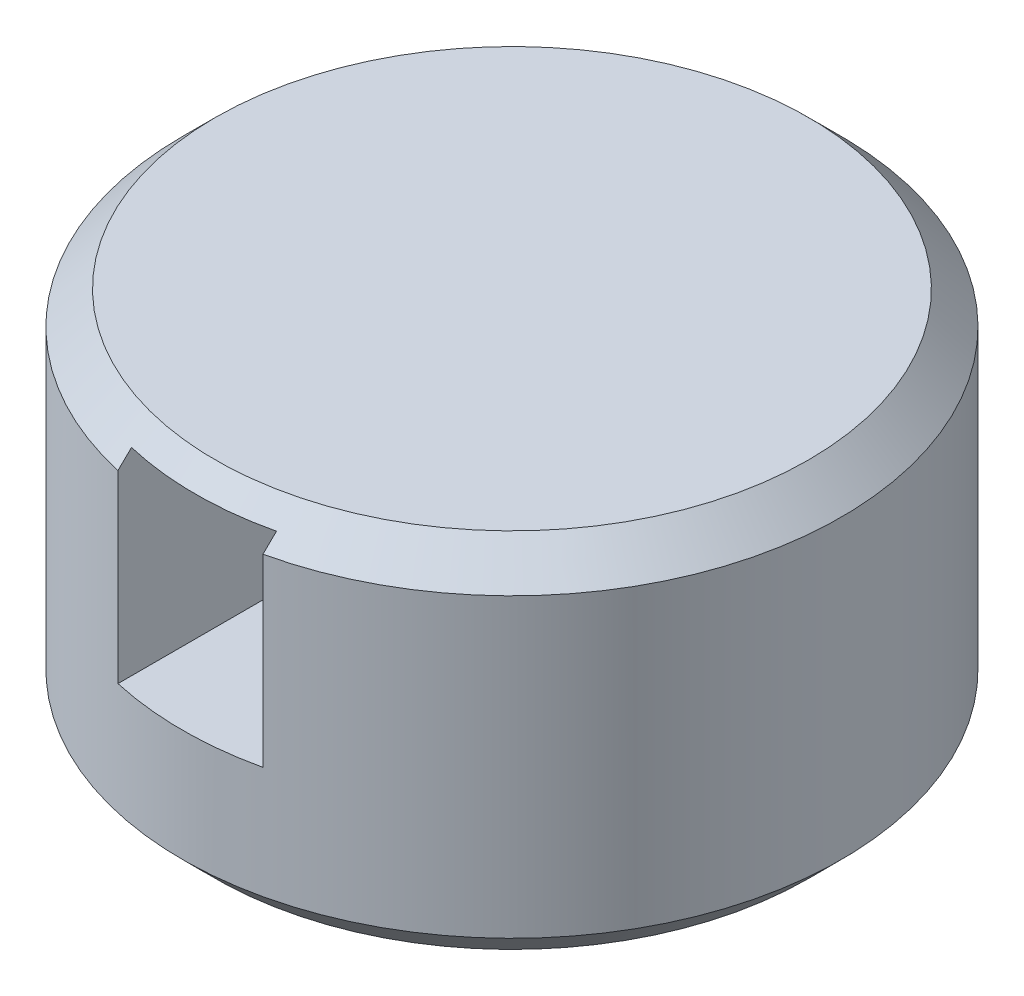
ISO-10303-21;
HEADER;
FILE_DESCRIPTION(('STEP AP214'),'2;1');
FILE_NAME('part.step','',(''),(''),'','','');
FILE_SCHEMA(('AUTOMOTIVE_DESIGN { 1 0 10303 214 1 1 1 1 }'));
ENDSEC;
DATA;
#1=APPLICATION_CONTEXT('core data for automotive mechanical design processes');
#2=APPLICATION_PROTOCOL_DEFINITION('international standard','automotive_design',2000,#1);
#3=PRODUCT_CONTEXT('',#1,'mechanical');
#4=PRODUCT('Part','Part','',(#3));
#5=PRODUCT_RELATED_PRODUCT_CATEGORY('part','',(#4));
#6=PRODUCT_DEFINITION_FORMATION('','',#4);
#7=PRODUCT_DEFINITION_CONTEXT('part definition',#1,'design');
#8=PRODUCT_DEFINITION('design','',#6,#7);
#9=PRODUCT_DEFINITION_SHAPE('','',#8);
#10=(LENGTH_UNIT() NAMED_UNIT(*) SI_UNIT(.MILLI.,.METRE.));
#11=(NAMED_UNIT(*) PLANE_ANGLE_UNIT() SI_UNIT($,.RADIAN.));
#12=(NAMED_UNIT(*) SI_UNIT($,.STERADIAN.) SOLID_ANGLE_UNIT());
#13=UNCERTAINTY_MEASURE_WITH_UNIT(LENGTH_MEASURE(1.E-05),#10,'distance_accuracy_value','');
#14=(GEOMETRIC_REPRESENTATION_CONTEXT(3) GLOBAL_UNCERTAINTY_ASSIGNED_CONTEXT((#13)) GLOBAL_UNIT_ASSIGNED_CONTEXT((#10,
#11,#12)) REPRESENTATION_CONTEXT('',''));
#15=CARTESIAN_POINT('',(0.,0.,0.));
#16=DIRECTION('',(0.,0.,1.));
#17=DIRECTION('',(1.,0.,0.));
#18=AXIS2_PLACEMENT_3D('',#15,#16,#17);
#19=CARTESIAN_POINT('',(-11.,16.,18.));
#20=DIRECTION('',(-1.,0.,0.));
#21=DIRECTION('',(0.,0.,1.));
#22=AXIS2_PLACEMENT_3D('',#19,#20,#21);
#23=PLANE('',#22);
#24=DIRECTION('',(0.,-1.,0.));
#25=VECTOR('',#24,1.);
#26=CARTESIAN_POINT('',(-11.,51.3553390593274,-5.93717104351895));
#27=LINE('',#26,#25);
#28=CARTESIAN_POINT('',(-11.,0.,-5.93717104351895));
#29=VERTEX_POINT('',#28);
#30=CARTESIAN_POINT('',(-11.,16.,-5.93717104351895));
#31=VERTEX_POINT('',#30);
#32=EDGE_CURVE('E342',#29,#31,#27,.F.);
#33=ORIENTED_EDGE('',*,*,#32,.F.);
#34=DIRECTION('',(0.,0.,-1.));
#35=VECTOR('',#34,1.);
#36=CARTESIAN_POINT('',(-11.,0.,18.));
#37=LINE('',#36,#35);
#38=CARTESIAN_POINT('',(-11.,0.,-38.));
#39=VERTEX_POINT('',#38);
#40=EDGE_CURVE('E217',#29,#39,#37,.T.);
#41=ORIENTED_EDGE('',*,*,#40,.T.);
#42=DIRECTION('',(0.,-1.,0.));
#43=VECTOR('',#42,1.);
#44=CARTESIAN_POINT('',(-11.,16.,-38.));
#45=LINE('',#44,#43);
#46=CARTESIAN_POINT('',(-11.,16.,-38.));
#47=VERTEX_POINT('',#46);
#48=EDGE_CURVE('E211',#47,#39,#45,.T.);
#49=ORIENTED_EDGE('',*,*,#48,.F.);
#50=DIRECTION('',(0.,0.,-1.));
#51=VECTOR('',#50,1.);
#52=CARTESIAN_POINT('',(-11.,16.,18.));
#53=LINE('',#52,#51);
#54=CARTESIAN_POINT('',(-11.,16.,-31.5));
#55=VERTEX_POINT('',#54);
#56=EDGE_CURVE('E199',#55,#47,#53,.T.);
#57=ORIENTED_EDGE('',*,*,#56,.F.);
#58=DIRECTION('',(0.,-1.,0.));
#59=VECTOR('',#58,1.);
#60=CARTESIAN_POINT('',(-11.,52.,-31.5));
#61=LINE('',#60,#59);
#62=CARTESIAN_POINT('',(-11.,52.,-31.5));
#63=VERTEX_POINT('',#62);
#64=EDGE_CURVE('E188',#63,#55,#61,.T.);
#65=ORIENTED_EDGE('',*,*,#64,.F.);
#66=DIRECTION('',(0.,0.,-1.));
#67=VECTOR('',#66,1.);
#68=CARTESIAN_POINT('',(-11.,52.,11.5));
#69=LINE('',#68,#67);
#70=CARTESIAN_POINT('',(-11.,52.,46.7225855448947));
#71=VERTEX_POINT('',#70);
#72=EDGE_CURVE('E190',#71,#63,#69,.T.);
#73=ORIENTED_EDGE('',*,*,#72,.F.);
#74=CARTESIAN_POINT('',(-11.,11.4478869475975,87.8662433818898));
#75=CARTESIAN_POINT('',(-11.,12.7651998091382,86.5386443641049));
#76=CARTESIAN_POINT('',(-11.,14.0822841919575,85.2108186174358));
#77=CARTESIAN_POINT('',(-11.,16.7159194431291,82.5546363878002));
#78=CARTESIAN_POINT('',(-11.,18.032470311124,81.2262799044796));
#79=CARTESIAN_POINT('',(-11.,21.9819162600289,77.2395832931839));
#80=CARTESIAN_POINT('',(-11.,24.6138929300713,74.5803331503215));
#81=CARTESIAN_POINT('',(-11.,29.8887039030054,69.2441930694006));
#82=CARTESIAN_POINT('',(-11.,32.5315202153767,66.5672853403224));
#83=CARTESIAN_POINT('',(-11.,36.4917950499284,62.5487270131779));
#84=CARTESIAN_POINT('',(-11.,37.8110547757049,61.2088515830394));
#85=CARTESIAN_POINT('',(-11.,40.4480988498673,58.5276661380014));
#86=CARTESIAN_POINT('',(-11.,41.7658832074933,57.1863561321902));
#87=CARTESIAN_POINT('',(-11.,44.8013924870986,54.0925250340886));
#88=CARTESIAN_POINT('',(-11.,46.5184871873735,52.3393853199298));
#89=CARTESIAN_POINT('',(-11.,49.9486393339829,48.8290677212756));
#90=CARTESIAN_POINT('',(-11.,51.6616966708632,47.0718897297949));
#91=CARTESIAN_POINT('',(-11.,55.0837403614528,43.5504779087907));
#92=CARTESIAN_POINT('',(-11.,56.7927216347954,41.7862391366429));
#93=CARTESIAN_POINT('',(-11.,59.3500066223273,39.134080659097));
#94=CARTESIAN_POINT('',(-11.,60.2013625843158,38.2491042514226));
#95=CARTESIAN_POINT('',(-11.,61.9015689789879,36.4767498489538));
#96=CARTESIAN_POINT('',(-11.,62.7504194161215,35.5893718584302));
#97=CARTESIAN_POINT('',(-11.,64.4415040792245,33.8153542450702));
#98=CARTESIAN_POINT('',(-11.,65.2837511416269,32.92872686414));
#99=CARTESIAN_POINT('',(-11.,66.9643865605772,31.1518071912283));
#100=CARTESIAN_POINT('',(-11.,67.8027748885179,30.2615148721686));
#101=CARTESIAN_POINT('',(-11.,69.4749165542753,28.4759347727942));
#102=CARTESIAN_POINT('',(-11.,70.3086679619013,27.5806451837097));
#103=CARTESIAN_POINT('',(-11.,71.9696516500128,25.7840658790431));
#104=CARTESIAN_POINT('',(-11.,72.7968840848477,24.8827763064603));
#105=CARTESIAN_POINT('',(-11.,74.030417293729,23.525613031509));
#106=CARTESIAN_POINT('',(-11.,74.4400262915871,23.0727459076199));
#107=CARTESIAN_POINT('',(-11.,75.2566483781968,22.1646781931972));
#108=CARTESIAN_POINT('',(-11.,75.6636614758163,21.7094776106446));
#109=CARTESIAN_POINT('',(-11.,76.4746572879058,20.7962929477561));
#110=CARTESIAN_POINT('',(-11.,76.8786396625231,20.3383085653797));
#111=CARTESIAN_POINT('',(-11.,77.6829139742727,19.4191109673549));
#112=CARTESIAN_POINT('',(-11.,78.0832059270462,18.9578977654058));
#113=CARTESIAN_POINT('',(-11.,78.8790468847688,18.0319343919229));
#114=CARTESIAN_POINT('',(-11.,79.2745989108476,17.5671868199863));
#115=CARTESIAN_POINT('',(-11.,80.0602225846576,16.6330579569837));
#116=CARTESIAN_POINT('',(-11.,80.4502941214262,16.1636765724243));
#117=CARTESIAN_POINT('',(-11.,81.2235116722836,15.2193946974667));
#118=CARTESIAN_POINT('',(-11.,81.6066590744816,14.7444953453575));
#119=CARTESIAN_POINT('',(-11.,82.3642721462314,13.7878336359076));
#120=CARTESIAN_POINT('',(-11.,82.738738326072,13.3060716846568));
#121=CARTESIAN_POINT('',(-11.,83.2251511474482,12.6651356328472));
#122=CARTESIAN_POINT('',(-11.,83.3421477439512,12.5097865715108));
#123=CARTESIAN_POINT('',(-11.,83.5748937473269,12.1981502849157));
#124=CARTESIAN_POINT('',(-11.,83.6906431242418,12.0418630372618));
#125=CARTESIAN_POINT('',(-11.,83.9207846258705,11.7282781568083));
#126=CARTESIAN_POINT('',(-11.,84.0351766739608,11.5709804677329));
#127=CARTESIAN_POINT('',(-11.,84.262465502413,11.2553090156253));
#128=CARTESIAN_POINT('',(-11.,84.3753622813757,11.0969352515864));
#129=CARTESIAN_POINT('',(-11.,84.7117490726082,10.6198668686094));
#130=CARTESIAN_POINT('',(-11.,84.9327833799904,10.2994317795806));
#131=CARTESIAN_POINT('',(-11.,85.366909127595,9.65321880159802));
#132=CARTESIAN_POINT('',(-11.,85.5800006911612,9.32744099572506));
#133=CARTESIAN_POINT('',(-11.,85.9944908177172,8.67282395981442));
#134=CARTESIAN_POINT('',(-11.,86.1959810783062,8.34404302814267));
#135=CARTESIAN_POINT('',(-11.,86.5871887195868,7.67955975824976));
#136=CARTESIAN_POINT('',(-11.,86.7769073041066,7.34385813246525));
#137=CARTESIAN_POINT('',(-11.,87.141581508967,6.66489719610116));
#138=CARTESIAN_POINT('',(-11.,87.3165512180559,6.32164550222156));
#139=CARTESIAN_POINT('',(-11.,87.6483010134922,5.62651853304949));
#140=CARTESIAN_POINT('',(-11.,87.8050869429764,5.27464607220465));
#141=CARTESIAN_POINT('',(-11.,88.0893563701438,4.5781757127418));
#142=CARTESIAN_POINT('',(-11.,88.2178627973541,4.23399930700639));
#143=CARTESIAN_POINT('',(-11.,88.4499148984554,3.53726813854583));
#144=CARTESIAN_POINT('',(-11.,88.5534635003321,3.18471436396783));
#145=CARTESIAN_POINT('',(-11.,88.7303676255789,2.47429034950314));
#146=CARTESIAN_POINT('',(-11.,88.8039041281818,2.11646587636456));
#147=CARTESIAN_POINT('',(-11.,88.917544882859,1.39549001715968));
#148=CARTESIAN_POINT('',(-11.,88.9576526478865,1.03233919491027));
#149=CARTESIAN_POINT('',(-11.,89.0020196570053,0.300348008158018));
#150=CARTESIAN_POINT('',(-11.,89.0059353364567,-0.0685136528978004));
#151=CARTESIAN_POINT('',(-11.,88.9767402148967,-0.804742255006879));
#152=CARTESIAN_POINT('',(-11.,88.94362864708,-1.17210916494688));
#153=CARTESIAN_POINT('',(-11.,88.8423878244562,-1.90377586576297));
#154=CARTESIAN_POINT('',(-11.,88.7740842033098,-2.26805111632763));
#155=CARTESIAN_POINT('',(-11.,88.606454533312,-2.98932731055479));
#156=CARTESIAN_POINT('',(-11.,88.5071212876864,-3.34632654619142));
#157=CARTESIAN_POINT('',(-11.,88.2240635055942,-4.2344303608779));
#158=CARTESIAN_POINT('',(-11.,88.0232623359371,-4.76009372340536));
#159=CARTESIAN_POINT('',(-11.,87.6886685603326,-5.53380365608996));
#160=CARTESIAN_POINT('',(-11.,87.5715038879317,-5.78936895430563));
#161=CARTESIAN_POINT('',(-11.,87.3276224528314,-6.29590549263094));
#162=CARTESIAN_POINT('',(-11.,87.2009065030451,-6.54687712145514));
#163=CARTESIAN_POINT('',(-11.,86.9382233791181,-7.04667306522964));
#164=CARTESIAN_POINT('',(-11.,86.8021857040219,-7.29546006520439));
#165=CARTESIAN_POINT('',(-11.,86.5230649133421,-7.7890437260451));
#166=CARTESIAN_POINT('',(-11.,86.3799817368975,-8.0338403524168));
#167=CARTESIAN_POINT('',(-11.,86.0878634765256,-8.51969543894476));
#168=CARTESIAN_POINT('',(-11.,85.9388311132447,-8.76075553940539));
#169=CARTESIAN_POINT('',(-11.,85.6356065530398,-9.2395942904287));
#170=CARTESIAN_POINT('',(-11.,85.4814144374647,-9.47737299264269));
#171=CARTESIAN_POINT('',(-11.,85.055246965065,-10.1212225478857));
#172=CARTESIAN_POINT('',(-11.,84.7788849568674,-10.5243912324667));
#173=CARTESIAN_POINT('',(-11.,84.2158158557707,-11.3234594098325));
#174=CARTESIAN_POINT('',(-11.,83.9291076645282,-11.7193581240711));
#175=CARTESIAN_POINT('',(-11.,83.3473591316737,-12.5052084424493));
#176=CARTESIAN_POINT('',(-11.,83.0523156086937,-12.8951576859446));
#177=CARTESIAN_POINT('',(-11.,82.4556068958463,-13.6699210821682));
#178=CARTESIAN_POINT('',(-11.,82.1539419464686,-14.0547354205823));
#179=CARTESIAN_POINT('',(-11.,81.5445666867907,-14.8208299521715));
#180=CARTESIAN_POINT('',(-11.,81.23684524267,-15.2021012740457));
#181=CARTESIAN_POINT('',(-11.,80.6169002950119,-15.9609654797909));
#182=CARTESIAN_POINT('',(-11.,80.304676757428,-16.3385583358076));
#183=CARTESIAN_POINT('',(-11.,79.6765379039162,-17.0905185282901));
#184=CARTESIAN_POINT('',(-11.,79.3606234024296,-17.4648865458117));
#185=CARTESIAN_POINT('',(-11.,78.7256176489154,-18.2109202314062));
#186=CARTESIAN_POINT('',(-11.,78.4065263740128,-18.5825858799869));
#187=CARTESIAN_POINT('',(-11.,77.4907581109996,-19.6414289378619));
#188=CARTESIAN_POINT('',(-11.,76.8907800150388,-20.3257516301333));
#189=CARTESIAN_POINT('',(-11.,75.6837741240874,-21.688209324672));
#190=CARTESIAN_POINT('',(-11.,75.0767458986999,-22.3663439446085));
#191=CARTESIAN_POINT('',(-11.,73.8599694872273,-23.7146612245541));
#192=CARTESIAN_POINT('',(-11.,73.2502456784743,-24.3848659008892));
#193=CARTESIAN_POINT('',(-11.,72.3324791884837,-25.3871949271851));
#194=CARTESIAN_POINT('',(-11.,72.026042012153,-25.7207919729904));
#195=CARTESIAN_POINT('',(-11.,71.4122039218689,-26.3870963263887));
#196=CARTESIAN_POINT('',(-11.,71.104803011016,-26.7198036368378));
#197=CARTESIAN_POINT('',(-11.,70.7969724069581,-27.0521130524025));
#198=B_SPLINE_CURVE_WITH_KNOTS('',3,(#74,#75,#76,#77,#78,#79,#80,#81,#82,#83,#84,#85,#86,#87,
#88,#89,#90,#91,#92,#93,#94,#95,#96,#97,#98,#99,#100,#101,#102,#103,#104,#105,#106,#107,#108,
#109,#110,#111,#112,#113,#114,#115,#116,#117,#118,#119,#120,#121,#122,#123,#124,#125,#126,#127,
#128,#129,#130,#131,#132,#133,#134,#135,#136,#137,#138,#139,#140,#141,#142,#143,#144,#145,#146,
#147,#148,#149,#150,#151,#152,#153,#154,#155,#156,#157,#158,#159,#160,#161,#162,#163,#164,#165,
#166,#167,#168,#169,#170,#171,#172,#173,#174,#175,#176,#177,#178,#179,#180,#181,#182,#183,#184,
#185,#186,#187,#188,#189,#190,#191,#192,#193,#194,#195,#196,#197),.UNSPECIFIED.,.F.,.F.,(4,2,2,
2,2,2,2,2,2,2,2,2,2,2,2,2,2,2,2,2,2,2,2,2,2,2,2,2,2,2,2,2,2,2,2,2,2,2,2,2,2,2,2,2,2,2,2,2,2,2,2,
2,2,2,2,2,2,2,2,2,2,4),(0.,5.61074778378456,11.2214993187521,22.4460335685751,33.7310992621438,
39.3721453668271,45.0131559427489,52.3750266733134,59.7370947424142,67.1058183882066,
70.7898222488068,74.4738195622501,78.1425153597067,81.8112383119257,85.4813886151103,
89.1514517576346,90.983331868843,92.8152057187913,94.6472820058788,96.4793505244781,
98.3101815149169,100.141049520627,101.971546319392,103.801935245995,104.385363282147,
104.968805300919,105.552280100755,106.135755446561,107.303475810812,108.471178033828,
109.627810656785,110.78432480132,111.939721370641,113.094745632552,114.196110138116,
115.297345371567,116.39183815412,117.486215904308,118.590971828024,119.695750630796,
120.806056693969,121.916620464486,123.601526218025,124.444837072549,125.288076233407,
126.13860452408,126.989140163138,127.839291198977,128.689428837595,130.155586355762,
131.621899980713,133.088781026681,134.555608883507,136.025446354286,137.495294946416,
138.964825110208,140.434365863253,143.164576184999,145.894954066248,148.613096973919,
149.972035054183,151.330968766806),.UNSPECIFIED.);
#199=CARTESIAN_POINT('',(-11.,50.,48.7749935930288));
#200=VERTEX_POINT('',#199);
#201=EDGE_CURVE('E313',#200,#71,#198,.T.);
#202=ORIENTED_EDGE('',*,*,#201,.F.);
#203=DIRECTION('',(0.,1.,0.));
#204=VECTOR('',#203,1.);
#205=CARTESIAN_POINT('',(-11.,55.,48.7749935930288));
#206=LINE('',#205,#204);
#207=CARTESIAN_POINT('',(-11.,22.,48.7749935930288));
#208=VERTEX_POINT('',#207);
#209=EDGE_CURVE('E321',#208,#200,#206,.T.);
#210=ORIENTED_EDGE('',*,*,#209,.F.);
#211=DIRECTION('',(0.,0.,-1.));
#212=VECTOR('',#211,1.);
#213=CARTESIAN_POINT('',(-11.,22.,50.));
#214=LINE('',#213,#212);
#215=CARTESIAN_POINT('',(-11.,22.,11.5));
#216=VERTEX_POINT('',#215);
#217=EDGE_CURVE('E168',#208,#216,#214,.T.);
#218=ORIENTED_EDGE('',*,*,#217,.T.);
#219=DIRECTION('',(0.,-1.,0.));
#220=VECTOR('',#219,1.);
#221=CARTESIAN_POINT('',(-11.,52.,11.5));
#222=LINE('',#221,#220);
#223=CARTESIAN_POINT('',(-11.,16.,11.5));
#224=VERTEX_POINT('',#223);
#225=EDGE_CURVE('E175',#216,#224,#222,.T.);
#226=ORIENTED_EDGE('',*,*,#225,.T.);
#227=CARTESIAN_POINT('',(-11.,16.,18.));
#228=VERTEX_POINT('',#227);
#229=EDGE_CURVE('E194',#228,#224,#53,.T.);
#230=ORIENTED_EDGE('',*,*,#229,.F.);
#231=DIRECTION('',(0.,-1.,0.));
#232=VECTOR('',#231,1.);
#233=CARTESIAN_POINT('',(-11.,16.,18.));
#234=LINE('',#233,#232);
#235=CARTESIAN_POINT('',(-11.,0.,18.));
#236=VERTEX_POINT('',#235);
#237=EDGE_CURVE('E230',#228,#236,#234,.T.);
#238=ORIENTED_EDGE('',*,*,#237,.T.);
#239=CARTESIAN_POINT('',(-11.,0.,5.93717104351896));
#240=VERTEX_POINT('',#239);
#241=EDGE_CURVE('E212',#236,#240,#37,.T.);
#242=ORIENTED_EDGE('',*,*,#241,.T.);
#243=DIRECTION('',(0.,-1.,0.));
#244=VECTOR('',#243,1.);
#245=CARTESIAN_POINT('',(-11.,51.3553390593274,5.93717104351896));
#246=LINE('',#245,#244);
#247=CARTESIAN_POINT('',(-11.,16.,5.93717104351896));
#248=VERTEX_POINT('',#247);
#249=EDGE_CURVE('E339',#248,#240,#246,.T.);
#250=ORIENTED_EDGE('',*,*,#249,.F.);
#251=DIRECTION('',(0.,0.,1.));
#252=VECTOR('',#251,1.);
#253=CARTESIAN_POINT('',(-11.,16.,18.));
#254=LINE('',#253,#252);
#255=EDGE_CURVE('E336',#31,#248,#254,.T.);
#256=ORIENTED_EDGE('',*,*,#255,.F.);
#257=EDGE_LOOP('',(#33,#41,#49,#57,#65,#73,#202,#210,#218,#226,#230,#238,#242,#250,#256));
#258=FACE_BOUND('',#257,.T.);
#259=ADVANCED_FACE('F45',(#258),#23,.F.);
#260=CARTESIAN_POINT('',(11.,16.,18.));
#261=DIRECTION('',(1.,0.,0.));
#262=DIRECTION('',(0.,0.,-1.));
#263=AXIS2_PLACEMENT_3D('',#260,#261,#262);
#264=PLANE('',#263);
#265=DIRECTION('',(0.,-1.,0.));
#266=VECTOR('',#265,1.);
#267=CARTESIAN_POINT('',(11.,51.3553390593274,5.93717104351896));
#268=LINE('',#267,#266);
#269=CARTESIAN_POINT('',(11.,0.,5.93717104351896));
#270=VERTEX_POINT('',#269);
#271=CARTESIAN_POINT('',(11.,16.,5.93717104351896));
#272=VERTEX_POINT('',#271);
#273=EDGE_CURVE('E11',#270,#272,#268,.F.);
#274=ORIENTED_EDGE('',*,*,#273,.F.);
#275=DIRECTION('',(0.,0.,1.));
#276=VECTOR('',#275,1.);
#277=CARTESIAN_POINT('',(11.,0.,18.));
#278=LINE('',#277,#276);
#279=CARTESIAN_POINT('',(11.,0.,18.));
#280=VERTEX_POINT('',#279);
#281=EDGE_CURVE('E221',#270,#280,#278,.T.);
#282=ORIENTED_EDGE('',*,*,#281,.T.);
#283=DIRECTION('',(0.,-1.,0.));
#284=VECTOR('',#283,1.);
#285=CARTESIAN_POINT('',(11.,16.,18.));
#286=LINE('',#285,#284);
#287=CARTESIAN_POINT('',(11.,16.,18.));
#288=VERTEX_POINT('',#287);
#289=EDGE_CURVE('E234',#288,#280,#286,.T.);
#290=ORIENTED_EDGE('',*,*,#289,.F.);
#291=DIRECTION('',(0.,0.,1.));
#292=VECTOR('',#291,1.);
#293=CARTESIAN_POINT('',(11.,16.,18.));
#294=LINE('',#293,#292);
#295=CARTESIAN_POINT('',(11.,16.,11.5));
#296=VERTEX_POINT('',#295);
#297=EDGE_CURVE('E182',#296,#288,#294,.T.);
#298=ORIENTED_EDGE('',*,*,#297,.F.);
#299=DIRECTION('',(0.,-1.,0.));
#300=VECTOR('',#299,1.);
#301=CARTESIAN_POINT('',(11.,52.,11.5));
#302=LINE('',#301,#300);
#303=CARTESIAN_POINT('',(11.,22.,11.5));
#304=VERTEX_POINT('',#303);
#305=EDGE_CURVE('E173',#304,#296,#302,.T.);
#306=ORIENTED_EDGE('',*,*,#305,.F.);
#307=DIRECTION('',(0.,0.,-1.));
#308=VECTOR('',#307,1.);
#309=CARTESIAN_POINT('',(11.,22.,50.));
#310=LINE('',#309,#308);
#311=CARTESIAN_POINT('',(11.,22.,48.7749935930288));
#312=VERTEX_POINT('',#311);
#313=EDGE_CURVE('E157',#312,#304,#310,.T.);
#314=ORIENTED_EDGE('',*,*,#313,.F.);
#315=DIRECTION('',(0.,1.,0.));
#316=VECTOR('',#315,1.);
#317=CARTESIAN_POINT('',(11.,55.,48.7749935930288));
#318=LINE('',#317,#316);
#319=CARTESIAN_POINT('',(11.,50.,48.7749935930288));
#320=VERTEX_POINT('',#319);
#321=EDGE_CURVE('E298',#320,#312,#318,.F.);
#322=ORIENTED_EDGE('',*,*,#321,.F.);
#323=CARTESIAN_POINT('',(11.,70.7969724069581,-27.0521130524025));
#324=CARTESIAN_POINT('',(11.,71.1736384067404,-26.6454864234786));
#325=CARTESIAN_POINT('',(11.,71.5496680806889,-26.2382689099347));
#326=CARTESIAN_POINT('',(11.,72.3002491282274,-25.4224685746334));
#327=CARTESIAN_POINT('',(11.,72.674800491165,-25.0138857430768));
#328=CARTESIAN_POINT('',(11.,73.4222955042343,-24.1950876267686));
#329=CARTESIAN_POINT('',(11.,73.7952387851714,-23.7848720048101));
#330=CARTESIAN_POINT('',(11.,74.5391722577767,-22.962674265334));
#331=CARTESIAN_POINT('',(11.,74.9101624531952,-22.550692151211));
#332=CARTESIAN_POINT('',(11.,75.6520122487386,-21.722308327607));
#333=CARTESIAN_POINT('',(11.,76.0228587002716,-21.305894836494));
#334=CARTESIAN_POINT('',(11.,76.7618603586091,-20.470686574016));
#335=CARTESIAN_POINT('',(11.,77.1300155713707,-20.0518918079255));
#336=CARTESIAN_POINT('',(11.,77.863102983225,-19.2115692906495));
#337=CARTESIAN_POINT('',(11.,78.2280355299652,-18.7900418429758));
#338=CARTESIAN_POINT('',(11.,78.9540990933073,-17.9437245773052));
#339=CARTESIAN_POINT('',(11.,79.3152301274426,-17.5189347743705));
#340=CARTESIAN_POINT('',(11.,79.9609998938017,-16.7509878715724));
#341=CARTESIAN_POINT('',(11.,80.2464671926438,-16.4085278419666));
#342=CARTESIAN_POINT('',(11.,80.8139493259043,-15.7207603809165));
#343=CARTESIAN_POINT('',(11.,81.0959641874144,-15.3754529718513));
#344=CARTESIAN_POINT('',(11.,81.655984046013,-14.6814490712061));
#345=CARTESIAN_POINT('',(11.,81.9339879802459,-14.3327517208604));
#346=CARTESIAN_POINT('',(11.,82.4851132919693,-13.6315175218221));
#347=CARTESIAN_POINT('',(11.,82.7582347056607,-13.2789807016282));
#348=CARTESIAN_POINT('',(11.,83.298316880403,-12.5697656943619));
#349=CARTESIAN_POINT('',(11.,83.5652835170194,-12.213091990867));
#350=CARTESIAN_POINT('',(11.,84.0920527140895,-11.4944574326894));
#351=CARTESIAN_POINT('',(11.,84.3518549925665,-11.1324963707606));
#352=CARTESIAN_POINT('',(11.,84.8624907007643,-10.402510271401));
#353=CARTESIAN_POINT('',(11.,85.1133278900533,-10.0344878727039));
#354=CARTESIAN_POINT('',(11.,85.6039094301948,-9.29114769673859));
#355=CARTESIAN_POINT('',(11.,85.843655026602,-8.91583074538311));
#356=CARTESIAN_POINT('',(11.,86.3025599655467,-8.16730158652194));
#357=CARTESIAN_POINT('',(11.,86.5221097582586,-7.79433004551958));
#358=CARTESIAN_POINT('',(11.,86.9444370934454,-7.03888053014592));
#359=CARTESIAN_POINT('',(11.,87.1472127639444,-6.6564015009256));
#360=CARTESIAN_POINT('',(11.,87.5310936990586,-5.88106888444524));
#361=CARTESIAN_POINT('',(11.,87.7122190984122,-5.48822535790943));
#362=CARTESIAN_POINT('',(11.,88.0470012815703,-4.69093947451528));
#363=CARTESIAN_POINT('',(11.,88.2006657974374,-4.28650041990441));
#364=CARTESIAN_POINT('',(11.,88.4434738051784,-3.55591263958326));
#365=CARTESIAN_POINT('',(11.,88.5393772745554,-3.23202351606538));
#366=CARTESIAN_POINT('',(11.,88.7063963951114,-2.57786597644431));
#367=CARTESIAN_POINT('',(11.,88.777515132613,-2.24759836003356));
#368=CARTESIAN_POINT('',(11.,88.8914814340506,-1.58303024584346));
#369=CARTESIAN_POINT('',(11.,88.9344016668328,-1.24874239296657));
#370=CARTESIAN_POINT('',(11.,88.9899182526547,-0.577634081397531));
#371=CARTESIAN_POINT('',(11.,89.0025162822656,-0.240813763763152));
#372=CARTESIAN_POINT('',(11.,88.9966396878951,0.433528578591445));
#373=CARTESIAN_POINT('',(11.,88.9780748728655,0.771049806631931));
#374=CARTESIAN_POINT('',(11.,88.9107916624959,1.44304664640634));
#375=CARTESIAN_POINT('',(11.,88.8620710785043,1.77752203529064));
#376=CARTESIAN_POINT('',(11.,88.7369525391721,2.44192624266655));
#377=CARTESIAN_POINT('',(11.,88.6604950537856,2.77184368565779));
#378=CARTESIAN_POINT('',(11.,88.4833995036619,3.425055218542));
#379=CARTESIAN_POINT('',(11.,88.3827599786363,3.74834890716418));
#380=CARTESIAN_POINT('',(11.,88.1481573979214,4.42471997559179));
#381=CARTESIAN_POINT('',(11.,88.0116870996324,4.77692039698328));
#382=CARTESIAN_POINT('',(11.,87.7179083748638,5.47259353749401));
#383=CARTESIAN_POINT('',(11.,87.5605910932409,5.81606247344722));
#384=CARTESIAN_POINT('',(11.,87.22890366301,6.49529711399434));
#385=CARTESIAN_POINT('',(11.,87.0545060782003,6.83104931881173));
#386=CARTESIAN_POINT('',(11.,86.692162937021,7.49505928762147));
#387=CARTESIAN_POINT('',(11.,86.5042190920428,7.82331799144339));
#388=CARTESIAN_POINT('',(11.,86.1156869896269,8.4760546283967));
#389=CARTESIAN_POINT('',(11.,85.9150040776635,8.80047595607612));
#390=CARTESIAN_POINT('',(11.,85.5045382931174,9.44349724896051));
#391=CARTESIAN_POINT('',(11.,85.2947552048034,9.76209707590453));
#392=CARTESIAN_POINT('',(11.,84.8679337139646,10.3939226854493));
#393=CARTESIAN_POINT('',(11.,84.6509027822482,10.707153527019));
#394=CARTESIAN_POINT('',(11.,84.3207276380053,11.1737023219433));
#395=CARTESIAN_POINT('',(11.,84.2098992053665,11.3286671030362));
#396=CARTESIAN_POINT('',(11.,83.9868266300989,11.6375743740744));
#397=CARTESIAN_POINT('',(11.,83.8745824885936,11.7915168648311));
#398=CARTESIAN_POINT('',(11.,83.5137352948319,12.2820652298967));
#399=CARTESIAN_POINT('',(11.,83.2626598357547,12.6168546083312));
#400=CARTESIAN_POINT('',(11.,82.7553377537306,13.282498430436));
#401=CARTESIAN_POINT('',(11.,82.4990909551078,13.6133527398191));
#402=CARTESIAN_POINT('',(11.,81.9822381315809,14.2716967248898));
#403=CARTESIAN_POINT('',(11.,81.7216316085426,14.5991860090994));
#404=CARTESIAN_POINT('',(11.,81.1967503921435,15.2512142134363));
#405=CARTESIAN_POINT('',(11.,80.9324756496312,15.5757530939337));
#406=CARTESIAN_POINT('',(11.,80.1347333031724,16.5458374163817));
#407=CARTESIAN_POINT('',(11.,79.5965923670392,17.1875409068304));
#408=CARTESIAN_POINT('',(11.,78.5111242509268,18.4630328193195));
#409=CARTESIAN_POINT('',(11.,77.9637976174581,19.0968217083601));
#410=CARTESIAN_POINT('',(11.,76.8611458199894,20.3593024749057));
#411=CARTESIAN_POINT('',(11.,76.3058086015834,20.9879838100903));
#412=CARTESIAN_POINT('',(11.,75.1896022461801,22.2404231560141));
#413=CARTESIAN_POINT('',(11.,74.6287330381819,22.8641811033782));
#414=CARTESIAN_POINT('',(11.,73.502755966735,24.1075384006073));
#415=CARTESIAN_POINT('',(11.,72.9376493319077,24.7271388641574));
#416=CARTESIAN_POINT('',(11.,71.8038863828044,25.9630759230079));
#417=CARTESIAN_POINT('',(11.,71.2352300843269,26.579412532812));
#418=CARTESIAN_POINT('',(11.,70.0973677876751,27.8068364037074));
#419=CARTESIAN_POINT('',(11.,69.5281738308589,28.4179348338608));
#420=CARTESIAN_POINT('',(11.,68.3873822254986,29.6378846831442));
#421=CARTESIAN_POINT('',(11.,67.8157845728533,30.2467360984371));
#422=CARTESIAN_POINT('',(11.,66.0979085991878,32.0705356277418));
#423=CARTESIAN_POINT('',(11.,64.9486212295123,33.282649451753));
#424=CARTESIAN_POINT('',(11.,62.64533946369,35.700207326993));
#425=CARTESIAN_POINT('',(11.,61.4913505324962,36.9056565926394));
#426=CARTESIAN_POINT('',(11.,59.1790514887178,39.3123538476651));
#427=CARTESIAN_POINT('',(11.,58.0207414658797,40.5136019233075));
#428=CARTESIAN_POINT('',(11.,55.9237837955078,42.6822409950153));
#429=CARTESIAN_POINT('',(11.,54.9857165371543,43.6501935481686));
#430=CARTESIAN_POINT('',(11.,53.1077848534122,45.5843540589426));
#431=CARTESIAN_POINT('',(11.,52.1679204274411,46.5505620159977));
#432=CARTESIAN_POINT('',(11.,49.3460903667893,49.4470336238042));
#433=CARTESIAN_POINT('',(11.,47.4619013962863,51.3751311235327));
#434=CARTESIAN_POINT('',(11.,43.6886298150873,55.2279028624597));
#435=CARTESIAN_POINT('',(11.,41.7995456738588,57.1525756016402));
#436=CARTESIAN_POINT('',(11.,38.01826276023,60.998849144682));
#437=CARTESIAN_POINT('',(11.,36.1260639954876,62.9204499560733));
#438=CARTESIAN_POINT('',(11.,32.3371186027735,66.7635287458523));
#439=CARTESIAN_POINT('',(11.,30.4403692468701,68.6850040340672));
#440=CARTESIAN_POINT('',(11.,26.6450232577938,72.5261323381969));
#441=CARTESIAN_POINT('',(11.,24.746426623047,74.4457853525563));
#442=CARTESIAN_POINT('',(11.,20.9485089779457,78.2829051382417));
#443=CARTESIAN_POINT('',(11.,19.0491885316442,80.2003724679374));
#444=CARTESIAN_POINT('',(11.,15.2493610335765,84.034126575941));
#445=CARTESIAN_POINT('',(11.,13.3488539832188,85.9504133556448));
#446=CARTESIAN_POINT('',(11.,11.4478869475975,87.8662433818898));
#447=B_SPLINE_CURVE_WITH_KNOTS('',3,(#323,#324,#325,#326,#327,#328,#329,#330,#331,#332,#333,
#334,#335,#336,#337,#338,#339,#340,#341,#342,#343,#344,#345,#346,#347,#348,#349,#350,#351,#352,
#353,#354,#355,#356,#357,#358,#359,#360,#361,#362,#363,#364,#365,#366,#367,#368,#369,#370,#371,
#372,#373,#374,#375,#376,#377,#378,#379,#380,#381,#382,#383,#384,#385,#386,#387,#388,#389,#390,
#391,#392,#393,#394,#395,#396,#397,#398,#399,#400,#401,#402,#403,#404,#405,#406,#407,#408,#409,
#410,#411,#412,#413,#414,#415,#416,#417,#418,#419,#420,#421,#422,#423,#424,#425,#426,#427,#428,
#429,#430,#431,#432,#433,#434,#435,#436,#437,#438,#439,#440,#441,#442,#443,#444,#445,#446),
.UNSPECIFIED.,.F.,.F.,(4,2,2,2,2,2,2,2,2,2,2,2,2,2,2,2,2,2,2,2,2,2,2,2,2,2,2,2,2,2,2,2,2,2,2,2,
2,2,2,2,2,2,2,2,2,2,2,2,2,2,2,2,2,2,2,2,2,2,2,2,2,4),(0.,1.66283053610174,3.3256730324101,
4.98887888563504,6.65208154404887,8.32489734905037,9.99770945007351,11.6703388349691,
13.3429605019882,14.6804522604011,16.0179335166645,17.355762912766,18.6935823855467,
20.0300668897735,21.3666039208653,22.7025737282213,24.0383931439475,25.3364337861797,
26.6346190936271,27.931587538109,29.2281902224757,30.2407335601697,31.2531507656597,
32.2629485834312,33.2726905663099,34.2853599710964,35.2981028822266,36.3130323680382,
37.3280231581286,38.4603392793252,39.5931379238369,40.7277870029283,41.8622929844779,
43.0065331738233,44.1508005037013,45.2939227147903,45.8654696099365,46.4370160514901,
47.6923786591176,48.9477839847607,50.2033337439147,51.4589003428119,53.9712174357021,
56.4833855823971,58.9998402550422,61.5163272675384,64.0321108655977,66.5478832747892,
69.0532312706022,71.5585835427889,76.5696140054957,81.5759159876595,86.5821145644889,
90.6258876567189,94.669662059905,102.757268858929,110.847817009548,118.93834529796,
127.038191216679,135.138044042455,143.23476455656,151.331475478884),.UNSPECIFIED.);
#448=CARTESIAN_POINT('',(11.,52.,46.7225855448947));
#449=VERTEX_POINT('',#448);
#450=EDGE_CURVE('E288',#449,#320,#447,.T.);
#451=ORIENTED_EDGE('',*,*,#450,.F.);
#452=DIRECTION('',(0.,0.,1.));
#453=VECTOR('',#452,1.);
#454=CARTESIAN_POINT('',(11.,52.,11.5));
#455=LINE('',#454,#453);
#456=CARTESIAN_POINT('',(11.,52.,-31.5));
#457=VERTEX_POINT('',#456);
#458=EDGE_CURVE('E63',#457,#449,#455,.T.);
#459=ORIENTED_EDGE('',*,*,#458,.F.);
#460=DIRECTION('',(0.,-1.,0.));
#461=VECTOR('',#460,1.);
#462=CARTESIAN_POINT('',(11.,52.,-31.5));
#463=LINE('',#462,#461);
#464=CARTESIAN_POINT('',(11.,16.,-31.5));
#465=VERTEX_POINT('',#464);
#466=EDGE_CURVE('E357',#457,#465,#463,.T.);
#467=ORIENTED_EDGE('',*,*,#466,.T.);
#468=CARTESIAN_POINT('',(11.,16.,-38.));
#469=VERTEX_POINT('',#468);
#470=EDGE_CURVE('E203',#469,#465,#294,.T.);
#471=ORIENTED_EDGE('',*,*,#470,.F.);
#472=DIRECTION('',(0.,-1.,0.));
#473=VECTOR('',#472,1.);
#474=CARTESIAN_POINT('',(11.,16.,-38.));
#475=LINE('',#474,#473);
#476=CARTESIAN_POINT('',(11.,0.,-38.));
#477=VERTEX_POINT('',#476);
#478=EDGE_CURVE('E238',#469,#477,#475,.T.);
#479=ORIENTED_EDGE('',*,*,#478,.T.);
#480=CARTESIAN_POINT('',(11.,0.,-5.93717104351896));
#481=VERTEX_POINT('',#480);
#482=EDGE_CURVE('E222',#477,#481,#278,.T.);
#483=ORIENTED_EDGE('',*,*,#482,.T.);
#484=DIRECTION('',(0.,-1.,0.));
#485=VECTOR('',#484,1.);
#486=CARTESIAN_POINT('',(11.,51.3553390593274,-5.93717104351896));
#487=LINE('',#486,#485);
#488=CARTESIAN_POINT('',(11.,16.,-5.93717104351896));
#489=VERTEX_POINT('',#488);
#490=EDGE_CURVE('E55',#489,#481,#487,.T.);
#491=ORIENTED_EDGE('',*,*,#490,.F.);
#492=DIRECTION('',(0.,0.,-1.));
#493=VECTOR('',#492,1.);
#494=CARTESIAN_POINT('',(11.,16.,18.));
#495=LINE('',#494,#493);
#496=EDGE_CURVE('E333',#272,#489,#495,.T.);
#497=ORIENTED_EDGE('',*,*,#496,.F.);
#498=EDGE_LOOP('',(#274,#282,#290,#298,#306,#314,#322,#451,#459,#467,#471,#479,#483,#491,#497));
#499=FACE_BOUND('',#498,.T.);
#500=ADVANCED_FACE('F180',(#499),#264,.F.);
#501=CARTESIAN_POINT('',(0.,16.,0.));
#502=DIRECTION('',(0.,-1.,0.));
#503=DIRECTION('',(1.,0.,0.));
#504=AXIS2_PLACEMENT_3D('',#501,#502,#503);
#505=PLANE('',#504);
#506=CARTESIAN_POINT('',(5.,16.,14.65));
#507=DIRECTION('',(0.,-1.,0.));
#508=DIRECTION('',(-1.,0.,0.));
#509=AXIS2_PLACEMENT_3D('',#506,#507,#508);
#510=CIRCLE('',#509,2.13);
#511=CARTESIAN_POINT('',(2.87,16.,14.65));
#512=VERTEX_POINT('',#511);
#513=EDGE_CURVE('E270',#512,#512,#510,.T.);
#514=ORIENTED_EDGE('',*,*,#513,.F.);
#515=EDGE_LOOP('',(#514));
#516=FACE_BOUND('',#515,.T.);
#517=CARTESIAN_POINT('',(-5.,16.,14.65));
#518=DIRECTION('',(0.,-1.,0.));
#519=DIRECTION('',(1.,0.,0.));
#520=AXIS2_PLACEMENT_3D('',#517,#518,#519);
#521=CIRCLE('',#520,2.13);
#522=CARTESIAN_POINT('',(-2.87,16.,14.65));
#523=VERTEX_POINT('',#522);
#524=EDGE_CURVE('E263',#523,#523,#521,.T.);
#525=ORIENTED_EDGE('',*,*,#524,.F.);
#526=EDGE_LOOP('',(#525));
#527=FACE_BOUND('',#526,.T.);
#528=ORIENTED_EDGE('',*,*,#229,.T.);
#529=DIRECTION('',(-1.,0.,0.));
#530=VECTOR('',#529,1.);
#531=CARTESIAN_POINT('',(11.,16.,11.5));
#532=LINE('',#531,#530);
#533=EDGE_CURVE('E345',#296,#224,#532,.T.);
#534=ORIENTED_EDGE('',*,*,#533,.F.);
#535=ORIENTED_EDGE('',*,*,#297,.T.);
#536=DIRECTION('',(-1.,0.,0.));
#537=VECTOR('',#536,1.);
#538=CARTESIAN_POINT('',(-11.,16.,18.));
#539=LINE('',#538,#537);
#540=EDGE_CURVE('E207',#288,#228,#539,.T.);
#541=ORIENTED_EDGE('',*,*,#540,.T.);
#542=EDGE_LOOP('',(#528,#534,#535,#541));
#543=FACE_BOUND('',#542,.T.);
#544=ADVANCED_FACE('F413',(#516,#527,#543),#505,.T.);
#545=CARTESIAN_POINT('',(0.,0.,0.));
#546=DIRECTION('',(0.,1.,0.));
#547=DIRECTION('',(-1.,0.,0.));
#548=AXIS2_PLACEMENT_3D('',#545,#546,#547);
#549=PLANE('',#548);
#550=CARTESIAN_POINT('',(0.,0.,0.));
#551=DIRECTION('',(0.,1.,0.));
#552=DIRECTION('',(-1.,0.,0.));
#553=AXIS2_PLACEMENT_3D('',#550,#551,#552);
#554=CIRCLE('',#553,12.5);
#555=EDGE_CURVE('E329',#270,#481,#554,.T.);
#556=ORIENTED_EDGE('',*,*,#555,.T.);
#557=ORIENTED_EDGE('',*,*,#482,.F.);
#558=DIRECTION('',(1.,0.,0.));
#559=VECTOR('',#558,1.);
#560=CARTESIAN_POINT('',(-11.,0.,-38.));
#561=LINE('',#560,#559);
#562=EDGE_CURVE('E216',#39,#477,#561,.T.);
#563=ORIENTED_EDGE('',*,*,#562,.F.);
#564=ORIENTED_EDGE('',*,*,#40,.F.);
#565=EDGE_CURVE('E325',#29,#240,#554,.T.);
#566=ORIENTED_EDGE('',*,*,#565,.T.);
#567=ORIENTED_EDGE('',*,*,#241,.F.);
#568=DIRECTION('',(-1.,0.,0.));
#569=VECTOR('',#568,1.);
#570=CARTESIAN_POINT('',(-11.,0.,18.));
#571=LINE('',#570,#569);
#572=EDGE_CURVE('E226',#280,#236,#571,.T.);
#573=ORIENTED_EDGE('',*,*,#572,.F.);
#574=ORIENTED_EDGE('',*,*,#281,.F.);
#575=EDGE_LOOP('',(#556,#557,#563,#564,#566,#567,#573,#574));
#576=FACE_BOUND('',#575,.T.);
#577=CARTESIAN_POINT('',(0.,0.,0.));
#578=DIRECTION('',(0.,1.,0.));
#579=DIRECTION('',(-1.,0.,0.));
#580=AXIS2_PLACEMENT_3D('',#577,#578,#579);
#581=CIRCLE('',#580,45.);
#582=CARTESIAN_POINT('',(-45.,0.,0.));
#583=VERTEX_POINT('',#582);
#584=EDGE_CURVE('E255',#583,#583,#581,.T.);
#585=ORIENTED_EDGE('',*,*,#584,.F.);
#586=EDGE_LOOP('',(#585));
#587=FACE_BOUND('',#586,.T.);
#588=ADVANCED_FACE('F47',(#576,#587),#549,.F.);
#589=CARTESIAN_POINT('',(0.,0.,0.));
#590=DIRECTION('',(0.,1.,0.));
#591=DIRECTION('',(-1.,0.,0.));
#592=AXIS2_PLACEMENT_3D('',#589,#590,#591);
#593=CONICAL_SURFACE('',#592,45.,0.785398163397448);
#594=CARTESIAN_POINT('',(0.,5.,0.));
#595=DIRECTION('',(0.,1.,0.));
#596=DIRECTION('',(-1.,0.,0.));
#597=AXIS2_PLACEMENT_3D('',#594,#595,#596);
#598=CIRCLE('',#597,50.);
#599=CARTESIAN_POINT('',(-50.,5.,0.));
#600=VERTEX_POINT('',#599);
#601=EDGE_CURVE('E251',#600,#600,#598,.T.);
#602=ORIENTED_EDGE('',*,*,#601,.F.);
#603=EDGE_LOOP('',(#602));
#604=FACE_BOUND('',#603,.T.);
#605=ORIENTED_EDGE('',*,*,#584,.T.);
#606=EDGE_LOOP('',(#605));
#607=FACE_BOUND('',#606,.T.);
#608=ADVANCED_FACE('F589',(#604,#607),#593,.T.);
#609=CARTESIAN_POINT('',(0.,55.,0.));
#610=DIRECTION('',(0.,1.,0.));
#611=DIRECTION('',(-1.,0.,0.));
#612=AXIS2_PLACEMENT_3D('',#609,#610,#611);
#613=CYLINDRICAL_SURFACE('',#612,50.);
#614=ORIENTED_EDGE('',*,*,#321,.T.);
#615=CARTESIAN_POINT('',(0.,22.,0.));
#616=DIRECTION('',(0.,-1.,0.));
#617=DIRECTION('',(0.,0.,-1.));
#618=AXIS2_PLACEMENT_3D('',#615,#616,#617);
#619=CIRCLE('',#618,50.);
#620=EDGE_CURVE('E163',#312,#208,#619,.T.);
#621=ORIENTED_EDGE('',*,*,#620,.T.);
#622=ORIENTED_EDGE('',*,*,#209,.T.);
#623=CARTESIAN_POINT('',(0.,50.,0.));
#624=DIRECTION('',(0.,1.,0.));
#625=DIRECTION('',(-1.,0.,0.));
#626=AXIS2_PLACEMENT_3D('',#623,#624,#625);
#627=CIRCLE('',#626,50.);
#628=EDGE_CURVE('E247',#320,#200,#627,.T.);
#629=ORIENTED_EDGE('',*,*,#628,.F.);
#630=EDGE_LOOP('',(#614,#621,#622,#629));
#631=FACE_BOUND('',#630,.T.);
#632=ORIENTED_EDGE('',*,*,#601,.T.);
#633=EDGE_LOOP('',(#632));
#634=FACE_BOUND('',#633,.T.);
#635=ADVANCED_FACE('F392',(#631,#634),#613,.T.);
#636=CARTESIAN_POINT('',(0.,50.,0.));
#637=DIRECTION('',(0.,-1.,0.));
#638=DIRECTION('',(1.,0.,0.));
#639=AXIS2_PLACEMENT_3D('',#636,#637,#638);
#640=CONICAL_SURFACE('',#639,50.,0.78539816339745);
#641=ORIENTED_EDGE('',*,*,#628,.T.);
#642=ORIENTED_EDGE('',*,*,#201,.T.);
#643=CARTESIAN_POINT('',(0.,52.,0.));
#644=DIRECTION('',(0.,1.,0.));
#645=DIRECTION('',(0.,0.,1.));
#646=AXIS2_PLACEMENT_3D('',#643,#644,#645);
#647=CIRCLE('',#646,48.);
#648=EDGE_CURVE('E283',#71,#449,#647,.T.);
#649=ORIENTED_EDGE('',*,*,#648,.T.);
#650=ORIENTED_EDGE('',*,*,#450,.T.);
#651=EDGE_LOOP('',(#641,#642,#649,#650));
#652=FACE_BOUND('',#651,.T.);
#653=CARTESIAN_POINT('',(0.,55.,0.));
#654=DIRECTION('',(0.,1.,0.));
#655=DIRECTION('',(-1.,0.,0.));
#656=AXIS2_PLACEMENT_3D('',#653,#654,#655);
#657=CIRCLE('',#656,45.);
#658=CARTESIAN_POINT('',(-45.,55.,0.));
#659=VERTEX_POINT('',#658);
#660=EDGE_CURVE('E233',#659,#659,#657,.T.);
#661=ORIENTED_EDGE('',*,*,#660,.F.);
#662=EDGE_LOOP('',(#661));
#663=FACE_BOUND('',#662,.T.);
#664=ADVANCED_FACE('F300',(#652,#663),#640,.T.);
#665=CARTESIAN_POINT('',(45.,55.,0.));
#666=DIRECTION('',(0.,-1.,0.));
#667=DIRECTION('',(1.,0.,0.));
#668=AXIS2_PLACEMENT_3D('',#665,#666,#667);
#669=PLANE('',#668);
#670=ORIENTED_EDGE('',*,*,#660,.T.);
#671=EDGE_LOOP('',(#670));
#672=FACE_BOUND('',#671,.T.);
#673=ADVANCED_FACE('F396',(#672),#669,.F.);
#674=CARTESIAN_POINT('',(-11.,16.,18.));
#675=DIRECTION('',(0.,0.,1.));
#676=DIRECTION('',(1.,0.,0.));
#677=AXIS2_PLACEMENT_3D('',#674,#675,#676);
#678=PLANE('',#677);
#679=ORIENTED_EDGE('',*,*,#572,.T.);
#680=ORIENTED_EDGE('',*,*,#237,.F.);
#681=ORIENTED_EDGE('',*,*,#540,.F.);
#682=ORIENTED_EDGE('',*,*,#289,.T.);
#683=EDGE_LOOP('',(#679,#680,#681,#682));
#684=FACE_BOUND('',#683,.T.);
#685=ADVANCED_FACE('F400',(#684),#678,.F.);
#686=CARTESIAN_POINT('',(-11.,16.,-38.));
#687=DIRECTION('',(0.,0.,-1.));
#688=DIRECTION('',(-1.,0.,0.));
#689=AXIS2_PLACEMENT_3D('',#686,#687,#688);
#690=PLANE('',#689);
#691=ORIENTED_EDGE('',*,*,#562,.T.);
#692=ORIENTED_EDGE('',*,*,#478,.F.);
#693=DIRECTION('',(1.,0.,0.));
#694=VECTOR('',#693,1.);
#695=CARTESIAN_POINT('',(-11.,16.,-38.));
#696=LINE('',#695,#694);
#697=EDGE_CURVE('E198',#47,#469,#696,.T.);
#698=ORIENTED_EDGE('',*,*,#697,.F.);
#699=ORIENTED_EDGE('',*,*,#48,.T.);
#700=EDGE_LOOP('',(#691,#692,#698,#699));
#701=FACE_BOUND('',#700,.T.);
#702=ADVANCED_FACE('F380',(#701),#690,.F.);
#703=CARTESIAN_POINT('',(-5.,16.,-34.85));
#704=DIRECTION('',(0.,-1.,0.));
#705=DIRECTION('',(-1.,0.,0.));
#706=AXIS2_PLACEMENT_3D('',#703,#704,#705);
#707=CIRCLE('',#706,2.13);
#708=CARTESIAN_POINT('',(-7.13000000000001,16.,-34.85));
#709=VERTEX_POINT('',#708);
#710=EDGE_CURVE('E564',#709,#709,#707,.T.);
#711=ORIENTED_EDGE('',*,*,#710,.F.);
#712=EDGE_LOOP('',(#711));
#713=FACE_BOUND('',#712,.T.);
#714=CARTESIAN_POINT('',(5.,16.,-34.85));
#715=DIRECTION('',(0.,-1.,0.));
#716=DIRECTION('',(1.,0.,0.));
#717=AXIS2_PLACEMENT_3D('',#714,#715,#716);
#718=CIRCLE('',#717,2.13);
#719=CARTESIAN_POINT('',(7.13,16.,-34.85));
#720=VERTEX_POINT('',#719);
#721=EDGE_CURVE('E276',#720,#720,#718,.T.);
#722=ORIENTED_EDGE('',*,*,#721,.F.);
#723=EDGE_LOOP('',(#722));
#724=FACE_BOUND('',#723,.T.);
#725=DIRECTION('',(1.,0.,0.));
#726=VECTOR('',#725,1.);
#727=CARTESIAN_POINT('',(11.,16.,-31.5));
#728=LINE('',#727,#726);
#729=EDGE_CURVE('E348',#55,#465,#728,.T.);
#730=ORIENTED_EDGE('',*,*,#729,.F.);
#731=ORIENTED_EDGE('',*,*,#56,.T.);
#732=ORIENTED_EDGE('',*,*,#697,.T.);
#733=ORIENTED_EDGE('',*,*,#470,.T.);
#734=EDGE_LOOP('',(#730,#731,#732,#733));
#735=FACE_BOUND('',#734,.T.);
#736=ADVANCED_FACE('F367',(#713,#724,#735),#505,.T.);
#737=CARTESIAN_POINT('',(11.,52.,-31.5));
#738=DIRECTION('',(0.,0.,-1.));
#739=DIRECTION('',(0.,1.,0.));
#740=AXIS2_PLACEMENT_3D('',#737,#738,#739);
#741=PLANE('',#740);
#742=ORIENTED_EDGE('',*,*,#729,.T.);
#743=ORIENTED_EDGE('',*,*,#466,.F.);
#744=DIRECTION('',(1.,0.,0.));
#745=VECTOR('',#744,1.);
#746=CARTESIAN_POINT('',(11.,52.,-31.5));
#747=LINE('',#746,#745);
#748=EDGE_CURVE('E184',#63,#457,#747,.T.);
#749=ORIENTED_EDGE('',*,*,#748,.F.);
#750=ORIENTED_EDGE('',*,*,#64,.T.);
#751=EDGE_LOOP('',(#742,#743,#749,#750));
#752=FACE_BOUND('',#751,.T.);
#753=ADVANCED_FACE('F363',(#752),#741,.F.);
#754=CARTESIAN_POINT('',(11.,52.,11.5));
#755=DIRECTION('',(0.,0.,1.));
#756=DIRECTION('',(0.,-1.,0.));
#757=AXIS2_PLACEMENT_3D('',#754,#755,#756);
#758=PLANE('',#757);
#759=ORIENTED_EDGE('',*,*,#225,.F.);
#760=DIRECTION('',(-1.,0.,0.));
#761=VECTOR('',#760,1.);
#762=CARTESIAN_POINT('',(-11.,22.,11.5));
#763=LINE('',#762,#761);
#764=EDGE_CURVE('E161',#304,#216,#763,.T.);
#765=ORIENTED_EDGE('',*,*,#764,.F.);
#766=ORIENTED_EDGE('',*,*,#305,.T.);
#767=ORIENTED_EDGE('',*,*,#533,.T.);
#768=EDGE_LOOP('',(#759,#765,#766,#767));
#769=FACE_BOUND('',#768,.T.);
#770=ADVANCED_FACE('F171',(#769),#758,.F.);
#771=CARTESIAN_POINT('',(0.,52.,0.));
#772=DIRECTION('',(0.,1.,0.));
#773=DIRECTION('',(0.,0.,1.));
#774=AXIS2_PLACEMENT_3D('',#771,#772,#773);
#775=PLANE('',#774);
#776=ORIENTED_EDGE('',*,*,#458,.T.);
#777=ORIENTED_EDGE('',*,*,#648,.F.);
#778=ORIENTED_EDGE('',*,*,#72,.T.);
#779=ORIENTED_EDGE('',*,*,#748,.T.);
#780=EDGE_LOOP('',(#776,#777,#778,#779));
#781=FACE_BOUND('',#780,.T.);
#782=ADVANCED_FACE('F387',(#781),#775,.F.);
#783=CARTESIAN_POINT('',(0.,16.,0.));
#784=DIRECTION('',(0.,-1.,0.));
#785=DIRECTION('',(1.,0.,0.));
#786=AXIS2_PLACEMENT_3D('',#783,#784,#785);
#787=PLANE('',#786);
#788=ORIENTED_EDGE('',*,*,#496,.T.);
#789=CARTESIAN_POINT('',(0.,16.,0.));
#790=DIRECTION('',(0.,-1.,0.));
#791=DIRECTION('',(1.,0.,0.));
#792=AXIS2_PLACEMENT_3D('',#789,#790,#791);
#793=CIRCLE('',#792,12.5);
#794=EDGE_CURVE('E330',#489,#272,#793,.T.);
#795=ORIENTED_EDGE('',*,*,#794,.T.);
#796=EDGE_LOOP('',(#788,#795));
#797=FACE_BOUND('',#796,.T.);
#798=ADVANCED_FACE('F426',(#797),#787,.T.);
#799=CARTESIAN_POINT('',(0.,51.3553390593274,0.));
#800=DIRECTION('',(0.,-1.,0.));
#801=DIRECTION('',(1.,0.,0.));
#802=AXIS2_PLACEMENT_3D('',#799,#800,#801);
#803=CYLINDRICAL_SURFACE('',#802,12.5);
#804=ORIENTED_EDGE('',*,*,#273,.T.);
#805=ORIENTED_EDGE('',*,*,#794,.F.);
#806=ORIENTED_EDGE('',*,*,#490,.T.);
#807=ORIENTED_EDGE('',*,*,#555,.F.);
#808=EDGE_LOOP('',(#804,#805,#806,#807));
#809=FACE_BOUND('',#808,.T.);
#810=ADVANCED_FACE('F429',(#809),#803,.F.);
#811=ORIENTED_EDGE('',*,*,#32,.T.);
#812=EDGE_CURVE('E70',#248,#31,#793,.T.);
#813=ORIENTED_EDGE('',*,*,#812,.F.);
#814=ORIENTED_EDGE('',*,*,#249,.T.);
#815=ORIENTED_EDGE('',*,*,#565,.F.);
#816=EDGE_LOOP('',(#811,#813,#814,#815));
#817=FACE_BOUND('',#816,.T.);
#818=ADVANCED_FACE('F427',(#817),#803,.F.);
#819=ORIENTED_EDGE('',*,*,#255,.T.);
#820=ORIENTED_EDGE('',*,*,#812,.T.);
#821=EDGE_LOOP('',(#819,#820));
#822=FACE_BOUND('',#821,.T.);
#823=ADVANCED_FACE('F310',(#822),#787,.T.);
#824=CARTESIAN_POINT('',(-11.,22.,50.));
#825=DIRECTION('',(0.,-1.,0.));
#826=DIRECTION('',(0.,0.,-1.));
#827=AXIS2_PLACEMENT_3D('',#824,#825,#826);
#828=PLANE('',#827);
#829=CARTESIAN_POINT('',(5.,22.,14.65));
#830=DIRECTION('',(0.,-1.,0.));
#831=DIRECTION('',(0.,0.,-1.));
#832=AXIS2_PLACEMENT_3D('',#829,#830,#831);
#833=CIRCLE('',#832,2.13);
#834=CARTESIAN_POINT('',(5.,22.,12.52));
#835=VERTEX_POINT('',#834);
#836=EDGE_CURVE('E49',#835,#835,#833,.T.);
#837=ORIENTED_EDGE('',*,*,#836,.T.);
#838=EDGE_LOOP('',(#837));
#839=FACE_BOUND('',#838,.T.);
#840=CARTESIAN_POINT('',(-5.,22.,14.65));
#841=DIRECTION('',(0.,-1.,0.));
#842=DIRECTION('',(0.,0.,-1.));
#843=AXIS2_PLACEMENT_3D('',#840,#841,#842);
#844=CIRCLE('',#843,2.13);
#845=CARTESIAN_POINT('',(-5.,22.,12.52));
#846=VERTEX_POINT('',#845);
#847=EDGE_CURVE('E260',#846,#846,#844,.T.);
#848=ORIENTED_EDGE('',*,*,#847,.T.);
#849=EDGE_LOOP('',(#848));
#850=FACE_BOUND('',#849,.T.);
#851=ORIENTED_EDGE('',*,*,#313,.T.);
#852=ORIENTED_EDGE('',*,*,#764,.T.);
#853=ORIENTED_EDGE('',*,*,#217,.F.);
#854=ORIENTED_EDGE('',*,*,#620,.F.);
#855=EDGE_LOOP('',(#851,#852,#853,#854));
#856=FACE_BOUND('',#855,.T.);
#857=ADVANCED_FACE('F159',(#839,#850,#856),#828,.F.);
#858=CARTESIAN_POINT('',(-5.,26.,14.65));
#859=DIRECTION('',(0.,-1.,0.));
#860=DIRECTION('',(1.,0.,0.));
#861=AXIS2_PLACEMENT_3D('',#858,#859,#860);
#862=CYLINDRICAL_SURFACE('',#861,2.13);
#863=ORIENTED_EDGE('',*,*,#524,.T.);
#864=EDGE_LOOP('',(#863));
#865=FACE_BOUND('',#864,.T.);
#866=ORIENTED_EDGE('',*,*,#847,.F.);
#867=EDGE_LOOP('',(#866));
#868=FACE_BOUND('',#867,.T.);
#869=ADVANCED_FACE('F501',(#865,#868),#862,.F.);
#870=CARTESIAN_POINT('',(5.,26.,14.65));
#871=DIRECTION('',(0.,-1.,0.));
#872=DIRECTION('',(1.,0.,0.));
#873=AXIS2_PLACEMENT_3D('',#870,#871,#872);
#874=CYLINDRICAL_SURFACE('',#873,2.13);
#875=ORIENTED_EDGE('',*,*,#513,.T.);
#876=EDGE_LOOP('',(#875));
#877=FACE_BOUND('',#876,.T.);
#878=ORIENTED_EDGE('',*,*,#836,.F.);
#879=EDGE_LOOP('',(#878));
#880=FACE_BOUND('',#879,.T.);
#881=ADVANCED_FACE('F510',(#877,#880),#874,.F.);
#882=CARTESIAN_POINT('',(5.,26.,-34.85));
#883=DIRECTION('',(0.,-1.,0.));
#884=DIRECTION('',(1.,0.,0.));
#885=AXIS2_PLACEMENT_3D('',#882,#883,#884);
#886=CYLINDRICAL_SURFACE('',#885,2.13);
#887=CARTESIAN_POINT('',(5.,26.,-34.85));
#888=DIRECTION('',(0.,-1.,0.));
#889=DIRECTION('',(1.,0.,0.));
#890=AXIS2_PLACEMENT_3D('',#887,#888,#889);
#891=CIRCLE('',#890,2.13);
#892=CARTESIAN_POINT('',(7.13,26.,-34.85));
#893=VERTEX_POINT('',#892);
#894=EDGE_CURVE('E567',#893,#893,#891,.T.);
#895=ORIENTED_EDGE('',*,*,#894,.F.);
#896=EDGE_LOOP('',(#895));
#897=FACE_BOUND('',#896,.T.);
#898=ORIENTED_EDGE('',*,*,#721,.T.);
#899=EDGE_LOOP('',(#898));
#900=FACE_BOUND('',#899,.T.);
#901=ADVANCED_FACE('F518',(#897,#900),#886,.F.);
#902=CARTESIAN_POINT('',(5.,26.,-34.85));
#903=DIRECTION('',(0.,-1.,0.));
#904=DIRECTION('',(1.,0.,0.));
#905=AXIS2_PLACEMENT_3D('',#902,#903,#904);
#906=PLANE('',#905);
#907=ORIENTED_EDGE('',*,*,#894,.T.);
#908=EDGE_LOOP('',(#907));
#909=FACE_BOUND('',#908,.T.);
#910=ADVANCED_FACE('F528',(#909),#906,.T.);
#911=CARTESIAN_POINT('',(-5.,26.,-34.85));
#912=DIRECTION('',(0.,-1.,0.));
#913=DIRECTION('',(1.,0.,0.));
#914=AXIS2_PLACEMENT_3D('',#911,#912,#913);
#915=CYLINDRICAL_SURFACE('',#914,2.13);
#916=CARTESIAN_POINT('',(-5.,26.,-34.85));
#917=DIRECTION('',(0.,-1.,0.));
#918=DIRECTION('',(-1.,0.,0.));
#919=AXIS2_PLACEMENT_3D('',#916,#917,#918);
#920=CIRCLE('',#919,2.13);
#921=CARTESIAN_POINT('',(-7.13000000000001,26.,-34.85));
#922=VERTEX_POINT('',#921);
#923=EDGE_CURVE('E279',#922,#922,#920,.T.);
#924=ORIENTED_EDGE('',*,*,#923,.F.);
#925=EDGE_LOOP('',(#924));
#926=FACE_BOUND('',#925,.T.);
#927=ORIENTED_EDGE('',*,*,#710,.T.);
#928=EDGE_LOOP('',(#927));
#929=FACE_BOUND('',#928,.T.);
#930=ADVANCED_FACE('F538',(#926,#929),#915,.F.);
#931=CARTESIAN_POINT('',(-5.,26.,-34.85));
#932=DIRECTION('',(0.,1.,0.));
#933=DIRECTION('',(-1.,0.,0.));
#934=AXIS2_PLACEMENT_3D('',#931,#932,#933);
#935=PLANE('',#934);
#936=ORIENTED_EDGE('',*,*,#923,.T.);
#937=EDGE_LOOP('',(#936));
#938=FACE_BOUND('',#937,.T.);
#939=ADVANCED_FACE('F548',(#938),#935,.F.);
#940=CLOSED_SHELL('',(#259,#500,#544,#588,#608,#635,#664,#673,#685,#702,#736,#753,#770,#782,
#798,#810,#818,#823,#857,#869,#881,#901,#910,#930,#939));
#941=MANIFOLD_SOLID_BREP('B2',#940);
#942=ADVANCED_BREP_SHAPE_REPRESENTATION('',(#18,#941),#14);
#943=SHAPE_DEFINITION_REPRESENTATION(#9,#942);
ENDSEC;
END-ISO-10303-21;
